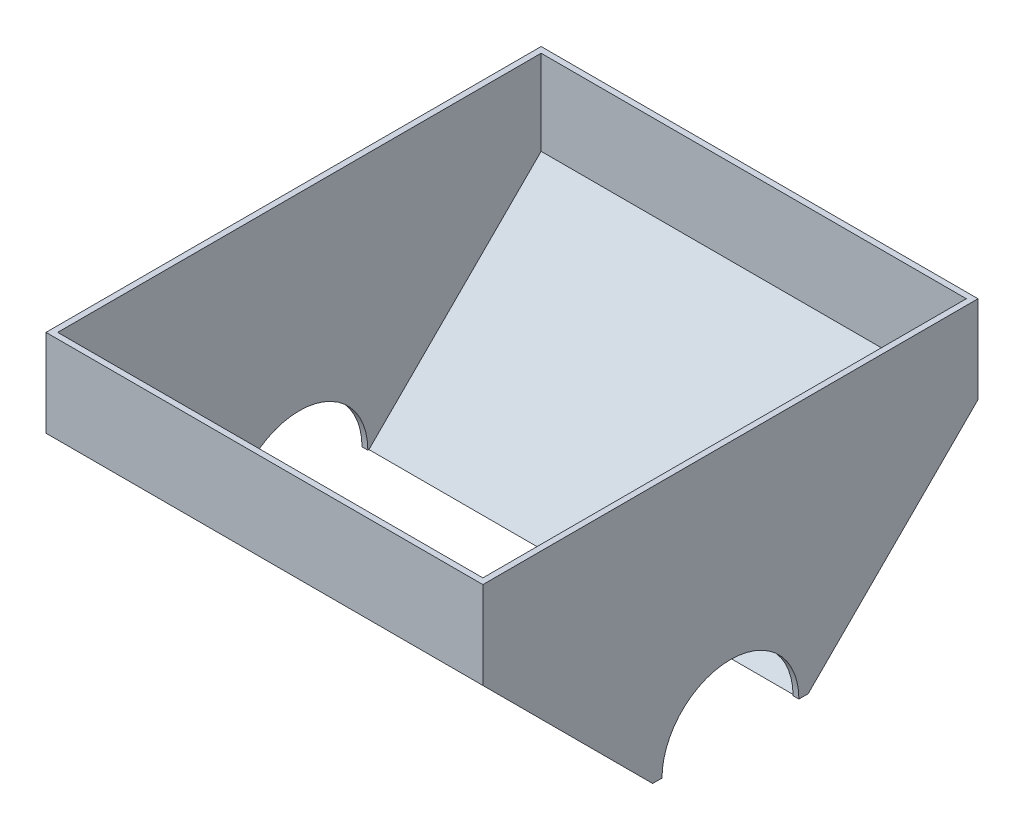
ISO-10303-21;
HEADER;
FILE_DESCRIPTION(('STEP AP214'),'2;1');
FILE_NAME('part.step','',(''),(''),'','','');
FILE_SCHEMA(('AUTOMOTIVE_DESIGN { 1 0 10303 214 1 1 1 1 }'));
ENDSEC;
DATA;
#1=APPLICATION_CONTEXT('core data for automotive mechanical design processes');
#2=APPLICATION_PROTOCOL_DEFINITION('international standard','automotive_design',2000,#1);
#3=PRODUCT_CONTEXT('',#1,'mechanical');
#4=PRODUCT('Part','Part','',(#3));
#5=PRODUCT_RELATED_PRODUCT_CATEGORY('part','',(#4));
#6=PRODUCT_DEFINITION_FORMATION('','',#4);
#7=PRODUCT_DEFINITION_CONTEXT('part definition',#1,'design');
#8=PRODUCT_DEFINITION('design','',#6,#7);
#9=PRODUCT_DEFINITION_SHAPE('','',#8);
#10=(LENGTH_UNIT() NAMED_UNIT(*) SI_UNIT(.MILLI.,.METRE.));
#11=(NAMED_UNIT(*) PLANE_ANGLE_UNIT() SI_UNIT($,.RADIAN.));
#12=(NAMED_UNIT(*) SI_UNIT($,.STERADIAN.) SOLID_ANGLE_UNIT());
#13=UNCERTAINTY_MEASURE_WITH_UNIT(LENGTH_MEASURE(1.E-05),#10,'distance_accuracy_value','');
#14=(GEOMETRIC_REPRESENTATION_CONTEXT(3) GLOBAL_UNCERTAINTY_ASSIGNED_CONTEXT((#13)) GLOBAL_UNIT_ASSIGNED_CONTEXT((#10,
#11,#12)) REPRESENTATION_CONTEXT('',''));
#15=CARTESIAN_POINT('',(0.,0.,0.));
#16=DIRECTION('',(0.,0.,1.));
#17=DIRECTION('',(1.,0.,0.));
#18=AXIS2_PLACEMENT_3D('',#15,#16,#17);
#19=CARTESIAN_POINT('',(75.,-88.2952718109188,26.704728189081));
#20=DIRECTION('',(0.,1.,0.));
#21=DIRECTION('',(0.,0.,1.));
#22=AXIS2_PLACEMENT_3D('',#19,#20,#21);
#23=PLANE('',#22);
#24=DIRECTION('',(0.,0.,-1.));
#25=VECTOR('',#24,1.);
#26=CARTESIAN_POINT('',(-75.,-88.2952718109188,26.704728189081));
#27=LINE('',#26,#25);
#28=CARTESIAN_POINT('',(-75.,-88.2952718109188,26.704728189081));
#29=VERTEX_POINT('',#28);
#30=CARTESIAN_POINT('',(-75.,-88.2952718109188,23.5));
#31=VERTEX_POINT('',#30);
#32=EDGE_CURVE('E180',#29,#31,#27,.T.);
#33=ORIENTED_EDGE('',*,*,#32,.T.);
#34=DIRECTION('',(1.,0.,0.));
#35=VECTOR('',#34,1.);
#36=CARTESIAN_POINT('',(-75.,-88.2952718109188,23.5));
#37=LINE('',#36,#35);
#38=CARTESIAN_POINT('',(-73.,-88.2952718109188,23.5));
#39=VERTEX_POINT('',#38);
#40=EDGE_CURVE('E155',#31,#39,#37,.T.);
#41=ORIENTED_EDGE('',*,*,#40,.T.);
#42=DIRECTION('',(0.,0.,-1.));
#43=VECTOR('',#42,1.);
#44=CARTESIAN_POINT('',(-73.,-88.2952718109188,26.704728189081));
#45=LINE('',#44,#43);
#46=CARTESIAN_POINT('',(-73.,-88.2952718109188,23.8763010643348));
#47=VERTEX_POINT('',#46);
#48=EDGE_CURVE('E267',#47,#39,#45,.T.);
#49=ORIENTED_EDGE('',*,*,#48,.F.);
#50=DIRECTION('',(-1.,0.,0.));
#51=VECTOR('',#50,1.);
#52=CARTESIAN_POINT('',(75.,-88.2952718109188,23.8763010643348));
#53=LINE('',#52,#51);
#54=CARTESIAN_POINT('',(73.,-88.2952718109188,23.8763010643348));
#55=VERTEX_POINT('',#54);
#56=EDGE_CURVE('E265',#55,#47,#53,.T.);
#57=ORIENTED_EDGE('',*,*,#56,.F.);
#58=DIRECTION('',(0.,0.,-1.));
#59=VECTOR('',#58,1.);
#60=CARTESIAN_POINT('',(73.,-88.2952718109188,26.704728189081));
#61=LINE('',#60,#59);
#62=CARTESIAN_POINT('',(73.,-88.2952718109188,23.5));
#63=VERTEX_POINT('',#62);
#64=EDGE_CURVE('E256',#55,#63,#61,.T.);
#65=ORIENTED_EDGE('',*,*,#64,.T.);
#66=CARTESIAN_POINT('',(75.,-88.2952718109188,23.5));
#67=VERTEX_POINT('',#66);
#68=EDGE_CURVE('E57',#63,#67,#37,.T.);
#69=ORIENTED_EDGE('',*,*,#68,.T.);
#70=DIRECTION('',(0.,0.,-1.));
#71=VECTOR('',#70,1.);
#72=CARTESIAN_POINT('',(75.,-88.2952718109188,26.704728189081));
#73=LINE('',#72,#71);
#74=CARTESIAN_POINT('',(75.,-88.2952718109188,26.704728189081));
#75=VERTEX_POINT('',#74);
#76=EDGE_CURVE('E244',#75,#67,#73,.T.);
#77=ORIENTED_EDGE('',*,*,#76,.F.);
#78=DIRECTION('',(-1.,0.,0.));
#79=VECTOR('',#78,1.);
#80=CARTESIAN_POINT('',(75.,-88.2952718109188,26.704728189081));
#81=LINE('',#80,#79);
#82=EDGE_CURVE('E210',#75,#29,#81,.T.);
#83=ORIENTED_EDGE('',*,*,#82,.T.);
#84=EDGE_LOOP('',(#33,#41,#49,#57,#65,#69,#77,#83));
#85=FACE_BOUND('',#84,.T.);
#86=ADVANCED_FACE('F41',(#85),#23,.F.);
#87=CARTESIAN_POINT('',(75.,-88.2952718109188,-23.5));
#88=VERTEX_POINT('',#87);
#89=CARTESIAN_POINT('',(75.,-88.2952718109188,-26.704728189081));
#90=VERTEX_POINT('',#89);
#91=EDGE_CURVE('E248',#88,#90,#73,.T.);
#92=ORIENTED_EDGE('',*,*,#91,.F.);
#93=DIRECTION('',(1.,0.,0.));
#94=VECTOR('',#93,1.);
#95=CARTESIAN_POINT('',(-75.,-88.2952718109188,-23.5));
#96=LINE('',#95,#94);
#97=CARTESIAN_POINT('',(73.,-88.2952718109188,-23.5));
#98=VERTEX_POINT('',#97);
#99=EDGE_CURVE('E174',#88,#98,#96,.F.);
#100=ORIENTED_EDGE('',*,*,#99,.T.);
#101=CARTESIAN_POINT('',(73.,-88.2952718109188,-23.8763010643348));
#102=VERTEX_POINT('',#101);
#103=EDGE_CURVE('E261',#98,#102,#61,.T.);
#104=ORIENTED_EDGE('',*,*,#103,.T.);
#105=DIRECTION('',(-1.,0.,0.));
#106=VECTOR('',#105,1.);
#107=CARTESIAN_POINT('',(75.,-88.2952718109188,-23.8763010643348));
#108=LINE('',#107,#106);
#109=CARTESIAN_POINT('',(-73.,-88.2952718109188,-23.8763010643348));
#110=VERTEX_POINT('',#109);
#111=EDGE_CURVE('E262',#102,#110,#108,.T.);
#112=ORIENTED_EDGE('',*,*,#111,.T.);
#113=CARTESIAN_POINT('',(-73.,-88.2952718109188,-23.5));
#114=VERTEX_POINT('',#113);
#115=EDGE_CURVE('E171',#114,#110,#45,.T.);
#116=ORIENTED_EDGE('',*,*,#115,.F.);
#117=CARTESIAN_POINT('',(-75.,-88.2952718109188,-23.5));
#118=VERTEX_POINT('',#117);
#119=EDGE_CURVE('E64',#114,#118,#96,.F.);
#120=ORIENTED_EDGE('',*,*,#119,.T.);
#121=CARTESIAN_POINT('',(-75.,-88.2952718109188,-26.704728189081));
#122=VERTEX_POINT('',#121);
#123=EDGE_CURVE('E168',#118,#122,#27,.T.);
#124=ORIENTED_EDGE('',*,*,#123,.T.);
#125=DIRECTION('',(-1.,0.,0.));
#126=VECTOR('',#125,1.);
#127=CARTESIAN_POINT('',(75.,-88.2952718109188,-26.704728189081));
#128=LINE('',#127,#126);
#129=EDGE_CURVE('E207',#90,#122,#128,.T.);
#130=ORIENTED_EDGE('',*,*,#129,.F.);
#131=EDGE_LOOP('',(#92,#100,#104,#112,#116,#120,#124,#130));
#132=FACE_BOUND('',#131,.T.);
#133=ADVANCED_FACE('F166',(#132),#23,.F.);
#134=CARTESIAN_POINT('',(75.,0.,0.));
#135=DIRECTION('',(0.,-1.,0.));
#136=DIRECTION('',(0.,0.,-1.));
#137=AXIS2_PLACEMENT_3D('',#134,#135,#136);
#138=PLANE('',#137);
#139=DIRECTION('',(0.,0.,1.));
#140=VECTOR('',#139,1.);
#141=CARTESIAN_POINT('',(-75.,0.,0.));
#142=LINE('',#141,#140);
#143=CARTESIAN_POINT('',(-75.,0.,-85.));
#144=VERTEX_POINT('',#143);
#145=CARTESIAN_POINT('',(-75.,0.,85.));
#146=VERTEX_POINT('',#145);
#147=EDGE_CURVE('E194',#144,#146,#142,.T.);
#148=ORIENTED_EDGE('',*,*,#147,.T.);
#149=DIRECTION('',(-1.,0.,0.));
#150=VECTOR('',#149,1.);
#151=CARTESIAN_POINT('',(75.,0.,85.));
#152=LINE('',#151,#150);
#153=CARTESIAN_POINT('',(75.,0.,85.));
#154=VERTEX_POINT('',#153);
#155=EDGE_CURVE('E50',#154,#146,#152,.T.);
#156=ORIENTED_EDGE('',*,*,#155,.F.);
#157=DIRECTION('',(0.,0.,1.));
#158=VECTOR('',#157,1.);
#159=CARTESIAN_POINT('',(75.,0.,0.));
#160=LINE('',#159,#158);
#161=CARTESIAN_POINT('',(75.,0.,-85.));
#162=VERTEX_POINT('',#161);
#163=EDGE_CURVE('E197',#162,#154,#160,.T.);
#164=ORIENTED_EDGE('',*,*,#163,.F.);
#165=DIRECTION('',(-1.,0.,0.));
#166=VECTOR('',#165,1.);
#167=CARTESIAN_POINT('',(75.,0.,-85.));
#168=LINE('',#167,#166);
#169=EDGE_CURVE('E198',#162,#144,#168,.T.);
#170=ORIENTED_EDGE('',*,*,#169,.T.);
#171=EDGE_LOOP('',(#148,#156,#164,#170));
#172=FACE_BOUND('',#171,.T.);
#173=DIRECTION('',(0.,0.,1.));
#174=VECTOR('',#173,1.);
#175=CARTESIAN_POINT('',(-73.,0.,0.));
#176=LINE('',#175,#174);
#177=CARTESIAN_POINT('',(-73.,0.,-83.));
#178=VERTEX_POINT('',#177);
#179=CARTESIAN_POINT('',(-73.,0.,83.));
#180=VERTEX_POINT('',#179);
#181=EDGE_CURVE('E275',#178,#180,#176,.T.);
#182=ORIENTED_EDGE('',*,*,#181,.F.);
#183=DIRECTION('',(-1.,0.,0.));
#184=VECTOR('',#183,1.);
#185=CARTESIAN_POINT('',(75.,0.,-83.));
#186=LINE('',#185,#184);
#187=CARTESIAN_POINT('',(73.,0.,-83.));
#188=VERTEX_POINT('',#187);
#189=EDGE_CURVE('E280',#188,#178,#186,.T.);
#190=ORIENTED_EDGE('',*,*,#189,.F.);
#191=DIRECTION('',(0.,0.,1.));
#192=VECTOR('',#191,1.);
#193=CARTESIAN_POINT('',(73.,0.,0.));
#194=LINE('',#193,#192);
#195=CARTESIAN_POINT('',(73.,0.,83.));
#196=VERTEX_POINT('',#195);
#197=EDGE_CURVE('E278',#188,#196,#194,.T.);
#198=ORIENTED_EDGE('',*,*,#197,.T.);
#199=DIRECTION('',(-1.,0.,0.));
#200=VECTOR('',#199,1.);
#201=CARTESIAN_POINT('',(75.,0.,83.));
#202=LINE('',#201,#200);
#203=EDGE_CURVE('E233',#196,#180,#202,.T.);
#204=ORIENTED_EDGE('',*,*,#203,.T.);
#205=EDGE_LOOP('',(#182,#190,#198,#204));
#206=FACE_BOUND('',#205,.T.);
#207=ADVANCED_FACE('F226',(#172,#206),#138,.F.);
#208=CARTESIAN_POINT('',(75.,0.,85.));
#209=DIRECTION('',(0.,0.,-1.));
#210=DIRECTION('',(0.,1.,0.));
#211=AXIS2_PLACEMENT_3D('',#208,#209,#210);
#212=PLANE('',#211);
#213=DIRECTION('',(0.,-1.,0.));
#214=VECTOR('',#213,1.);
#215=CARTESIAN_POINT('',(-75.,0.,85.));
#216=LINE('',#215,#214);
#217=CARTESIAN_POINT('',(-75.,-30.,85.));
#218=VERTEX_POINT('',#217);
#219=EDGE_CURVE('E185',#146,#218,#216,.T.);
#220=ORIENTED_EDGE('',*,*,#219,.T.);
#221=DIRECTION('',(-1.,0.,0.));
#222=VECTOR('',#221,1.);
#223=CARTESIAN_POINT('',(75.,-30.,85.));
#224=LINE('',#223,#222);
#225=CARTESIAN_POINT('',(75.,-30.,85.));
#226=VERTEX_POINT('',#225);
#227=EDGE_CURVE('E214',#226,#218,#224,.T.);
#228=ORIENTED_EDGE('',*,*,#227,.F.);
#229=DIRECTION('',(0.,-1.,0.));
#230=VECTOR('',#229,1.);
#231=CARTESIAN_POINT('',(75.,0.,85.));
#232=LINE('',#231,#230);
#233=EDGE_CURVE('E223',#154,#226,#232,.T.);
#234=ORIENTED_EDGE('',*,*,#233,.F.);
#235=ORIENTED_EDGE('',*,*,#155,.T.);
#236=EDGE_LOOP('',(#220,#228,#234,#235));
#237=FACE_BOUND('',#236,.T.);
#238=ADVANCED_FACE('F43',(#237),#212,.F.);
#239=CARTESIAN_POINT('',(75.,-30.,85.));
#240=DIRECTION('',(0.,0.707106781186549,-0.707106781186546));
#241=DIRECTION('',(0.,0.707106781186546,0.707106781186549));
#242=AXIS2_PLACEMENT_3D('',#239,#240,#241);
#243=PLANE('',#242);
#244=DIRECTION('',(0.,-0.707106781186546,-0.707106781186549));
#245=VECTOR('',#244,1.);
#246=CARTESIAN_POINT('',(-75.,-30.,85.));
#247=LINE('',#246,#245);
#248=EDGE_CURVE('E181',#218,#29,#247,.T.);
#249=ORIENTED_EDGE('',*,*,#248,.T.);
#250=ORIENTED_EDGE('',*,*,#82,.F.);
#251=DIRECTION('',(0.,-0.707106781186546,-0.707106781186549));
#252=VECTOR('',#251,1.);
#253=CARTESIAN_POINT('',(75.,-30.,85.));
#254=LINE('',#253,#252);
#255=EDGE_CURVE('E249',#226,#75,#254,.T.);
#256=ORIENTED_EDGE('',*,*,#255,.F.);
#257=ORIENTED_EDGE('',*,*,#227,.T.);
#258=EDGE_LOOP('',(#249,#250,#256,#257));
#259=FACE_BOUND('',#258,.T.);
#260=ADVANCED_FACE('F333',(#259),#243,.F.);
#261=CARTESIAN_POINT('',(75.,-30.,-85.));
#262=DIRECTION('',(0.,0.707106781186549,0.707106781186546));
#263=DIRECTION('',(0.,-0.707106781186546,0.707106781186549));
#264=AXIS2_PLACEMENT_3D('',#261,#262,#263);
#265=PLANE('',#264);
#266=DIRECTION('',(0.,0.707106781186546,-0.707106781186549));
#267=VECTOR('',#266,1.);
#268=CARTESIAN_POINT('',(-75.,-30.,-85.));
#269=LINE('',#268,#267);
#270=CARTESIAN_POINT('',(-75.,-30.,-85.));
#271=VERTEX_POINT('',#270);
#272=EDGE_CURVE('E178',#122,#271,#269,.T.);
#273=ORIENTED_EDGE('',*,*,#272,.T.);
#274=DIRECTION('',(-1.,0.,0.));
#275=VECTOR('',#274,1.);
#276=CARTESIAN_POINT('',(75.,-30.,-85.));
#277=LINE('',#276,#275);
#278=CARTESIAN_POINT('',(75.,-30.,-85.));
#279=VERTEX_POINT('',#278);
#280=EDGE_CURVE('E202',#279,#271,#277,.T.);
#281=ORIENTED_EDGE('',*,*,#280,.F.);
#282=DIRECTION('',(0.,0.707106781186546,-0.707106781186549));
#283=VECTOR('',#282,1.);
#284=CARTESIAN_POINT('',(75.,-30.,-85.));
#285=LINE('',#284,#283);
#286=EDGE_CURVE('E241',#90,#279,#285,.T.);
#287=ORIENTED_EDGE('',*,*,#286,.F.);
#288=ORIENTED_EDGE('',*,*,#129,.T.);
#289=EDGE_LOOP('',(#273,#281,#287,#288));
#290=FACE_BOUND('',#289,.T.);
#291=ADVANCED_FACE('F378',(#290),#265,.F.);
#292=CARTESIAN_POINT('',(75.,0.,-85.));
#293=DIRECTION('',(0.,0.,1.));
#294=DIRECTION('',(0.,-1.,0.));
#295=AXIS2_PLACEMENT_3D('',#292,#293,#294);
#296=PLANE('',#295);
#297=DIRECTION('',(0.,1.,0.));
#298=VECTOR('',#297,1.);
#299=CARTESIAN_POINT('',(-75.,0.,-85.));
#300=LINE('',#299,#298);
#301=EDGE_CURVE('E191',#271,#144,#300,.T.);
#302=ORIENTED_EDGE('',*,*,#301,.T.);
#303=ORIENTED_EDGE('',*,*,#169,.F.);
#304=DIRECTION('',(0.,1.,0.));
#305=VECTOR('',#304,1.);
#306=CARTESIAN_POINT('',(75.,0.,-85.));
#307=LINE('',#306,#305);
#308=EDGE_CURVE('E203',#279,#162,#307,.T.);
#309=ORIENTED_EDGE('',*,*,#308,.F.);
#310=ORIENTED_EDGE('',*,*,#280,.T.);
#311=EDGE_LOOP('',(#302,#303,#309,#310));
#312=FACE_BOUND('',#311,.T.);
#313=ADVANCED_FACE('F383',(#312),#296,.F.);
#314=CARTESIAN_POINT('',(75.,0.,0.));
#315=DIRECTION('',(1.,0.,0.));
#316=DIRECTION('',(0.,0.,-1.));
#317=AXIS2_PLACEMENT_3D('',#314,#315,#316);
#318=PLANE('',#317);
#319=CARTESIAN_POINT('',(75.,-88.2952718109188,0.));
#320=DIRECTION('',(1.,0.,0.));
#321=DIRECTION('',(0.,0.,-1.));
#322=AXIS2_PLACEMENT_3D('',#319,#320,#321);
#323=CIRCLE('',#322,23.5);
#324=EDGE_CURVE('E161',#88,#67,#323,.T.);
#325=ORIENTED_EDGE('',*,*,#324,.F.);
#326=ORIENTED_EDGE('',*,*,#91,.T.);
#327=ORIENTED_EDGE('',*,*,#286,.T.);
#328=ORIENTED_EDGE('',*,*,#308,.T.);
#329=ORIENTED_EDGE('',*,*,#163,.T.);
#330=ORIENTED_EDGE('',*,*,#233,.T.);
#331=ORIENTED_EDGE('',*,*,#255,.T.);
#332=ORIENTED_EDGE('',*,*,#76,.T.);
#333=EDGE_LOOP('',(#325,#326,#327,#328,#329,#330,#331,#332));
#334=FACE_BOUND('',#333,.T.);
#335=ADVANCED_FACE('F329',(#334),#318,.T.);
#336=CARTESIAN_POINT('',(-75.,0.,0.));
#337=DIRECTION('',(1.,0.,0.));
#338=DIRECTION('',(0.,0.,-1.));
#339=AXIS2_PLACEMENT_3D('',#336,#337,#338);
#340=PLANE('',#339);
#341=ORIENTED_EDGE('',*,*,#123,.F.);
#342=CARTESIAN_POINT('',(-75.,-88.2952718109188,0.));
#343=DIRECTION('',(1.,0.,0.));
#344=DIRECTION('',(0.,0.,-1.));
#345=AXIS2_PLACEMENT_3D('',#342,#343,#344);
#346=CIRCLE('',#345,23.5);
#347=EDGE_CURVE('E152',#118,#31,#346,.T.);
#348=ORIENTED_EDGE('',*,*,#347,.T.);
#349=ORIENTED_EDGE('',*,*,#32,.F.);
#350=ORIENTED_EDGE('',*,*,#248,.F.);
#351=ORIENTED_EDGE('',*,*,#219,.F.);
#352=ORIENTED_EDGE('',*,*,#147,.F.);
#353=ORIENTED_EDGE('',*,*,#301,.F.);
#354=ORIENTED_EDGE('',*,*,#272,.F.);
#355=EDGE_LOOP('',(#341,#348,#349,#350,#351,#352,#353,#354));
#356=FACE_BOUND('',#355,.T.);
#357=ADVANCED_FACE('F176',(#356),#340,.F.);
#358=CARTESIAN_POINT('',(75.,0.,83.));
#359=DIRECTION('',(0.,0.,-1.));
#360=DIRECTION('',(0.,1.,0.));
#361=AXIS2_PLACEMENT_3D('',#358,#359,#360);
#362=PLANE('',#361);
#363=DIRECTION('',(0.,-1.,0.));
#364=VECTOR('',#363,1.);
#365=CARTESIAN_POINT('',(-73.,0.,83.));
#366=LINE('',#365,#364);
#367=CARTESIAN_POINT('',(-73.,-29.1715728752538,83.));
#368=VERTEX_POINT('',#367);
#369=EDGE_CURVE('E307',#180,#368,#366,.T.);
#370=ORIENTED_EDGE('',*,*,#369,.F.);
#371=ORIENTED_EDGE('',*,*,#203,.F.);
#372=DIRECTION('',(0.,-1.,0.));
#373=VECTOR('',#372,1.);
#374=CARTESIAN_POINT('',(73.,0.,83.));
#375=LINE('',#374,#373);
#376=CARTESIAN_POINT('',(73.,-29.1715728752538,83.));
#377=VERTEX_POINT('',#376);
#378=EDGE_CURVE('E287',#196,#377,#375,.T.);
#379=ORIENTED_EDGE('',*,*,#378,.T.);
#380=DIRECTION('',(-1.,0.,0.));
#381=VECTOR('',#380,1.);
#382=CARTESIAN_POINT('',(75.,-29.1715728752538,83.));
#383=LINE('',#382,#381);
#384=EDGE_CURVE('E236',#377,#368,#383,.T.);
#385=ORIENTED_EDGE('',*,*,#384,.T.);
#386=EDGE_LOOP('',(#370,#371,#379,#385));
#387=FACE_BOUND('',#386,.T.);
#388=ADVANCED_FACE('F364',(#387),#362,.T.);
#389=CARTESIAN_POINT('',(75.,-28.5857864376269,83.5857864376269));
#390=DIRECTION('',(0.,0.707106781186549,-0.707106781186546));
#391=DIRECTION('',(0.,0.707106781186546,0.707106781186549));
#392=AXIS2_PLACEMENT_3D('',#389,#390,#391);
#393=PLANE('',#392);
#394=DIRECTION('',(0.,-0.707106781186546,-0.707106781186549));
#395=VECTOR('',#394,1.);
#396=CARTESIAN_POINT('',(-73.,-28.5857864376269,83.5857864376269));
#397=LINE('',#396,#395);
#398=EDGE_CURVE('E304',#368,#47,#397,.T.);
#399=ORIENTED_EDGE('',*,*,#398,.F.);
#400=ORIENTED_EDGE('',*,*,#384,.F.);
#401=DIRECTION('',(0.,-0.707106781186546,-0.707106781186549));
#402=VECTOR('',#401,1.);
#403=CARTESIAN_POINT('',(73.,-28.5857864376269,83.5857864376269));
#404=LINE('',#403,#402);
#405=EDGE_CURVE('E300',#377,#55,#404,.T.);
#406=ORIENTED_EDGE('',*,*,#405,.T.);
#407=ORIENTED_EDGE('',*,*,#56,.T.);
#408=EDGE_LOOP('',(#399,#400,#406,#407));
#409=FACE_BOUND('',#408,.T.);
#410=ADVANCED_FACE('F341',(#409),#393,.T.);
#411=CARTESIAN_POINT('',(75.,-28.5857864376269,-83.5857864376269));
#412=DIRECTION('',(0.,0.707106781186549,0.707106781186546));
#413=DIRECTION('',(0.,-0.707106781186546,0.707106781186549));
#414=AXIS2_PLACEMENT_3D('',#411,#412,#413);
#415=PLANE('',#414);
#416=DIRECTION('',(0.,0.707106781186546,-0.707106781186549));
#417=VECTOR('',#416,1.);
#418=CARTESIAN_POINT('',(-73.,-28.5857864376269,-83.5857864376269));
#419=LINE('',#418,#417);
#420=CARTESIAN_POINT('',(-73.,-29.1715728752538,-83.));
#421=VERTEX_POINT('',#420);
#422=EDGE_CURVE('E271',#110,#421,#419,.T.);
#423=ORIENTED_EDGE('',*,*,#422,.F.);
#424=ORIENTED_EDGE('',*,*,#111,.F.);
#425=DIRECTION('',(0.,0.707106781186546,-0.707106781186549));
#426=VECTOR('',#425,1.);
#427=CARTESIAN_POINT('',(73.,-28.5857864376269,-83.5857864376269));
#428=LINE('',#427,#426);
#429=CARTESIAN_POINT('',(73.,-29.1715728752538,-83.));
#430=VERTEX_POINT('',#429);
#431=EDGE_CURVE('E260',#102,#430,#428,.T.);
#432=ORIENTED_EDGE('',*,*,#431,.T.);
#433=DIRECTION('',(-1.,0.,0.));
#434=VECTOR('',#433,1.);
#435=CARTESIAN_POINT('',(75.,-29.1715728752538,-83.));
#436=LINE('',#435,#434);
#437=EDGE_CURVE('E266',#430,#421,#436,.T.);
#438=ORIENTED_EDGE('',*,*,#437,.T.);
#439=EDGE_LOOP('',(#423,#424,#432,#438));
#440=FACE_BOUND('',#439,.T.);
#441=ADVANCED_FACE('F355',(#440),#415,.T.);
#442=CARTESIAN_POINT('',(75.,0.,-83.));
#443=DIRECTION('',(0.,0.,1.));
#444=DIRECTION('',(0.,-1.,0.));
#445=AXIS2_PLACEMENT_3D('',#442,#443,#444);
#446=PLANE('',#445);
#447=DIRECTION('',(0.,1.,0.));
#448=VECTOR('',#447,1.);
#449=CARTESIAN_POINT('',(-73.,0.,-83.));
#450=LINE('',#449,#448);
#451=EDGE_CURVE('E279',#421,#178,#450,.T.);
#452=ORIENTED_EDGE('',*,*,#451,.F.);
#453=ORIENTED_EDGE('',*,*,#437,.F.);
#454=DIRECTION('',(0.,1.,0.));
#455=VECTOR('',#454,1.);
#456=CARTESIAN_POINT('',(73.,0.,-83.));
#457=LINE('',#456,#455);
#458=EDGE_CURVE('E284',#430,#188,#457,.T.);
#459=ORIENTED_EDGE('',*,*,#458,.T.);
#460=ORIENTED_EDGE('',*,*,#189,.T.);
#461=EDGE_LOOP('',(#452,#453,#459,#460));
#462=FACE_BOUND('',#461,.T.);
#463=ADVANCED_FACE('F360',(#462),#446,.T.);
#464=CARTESIAN_POINT('',(73.,0.,0.));
#465=DIRECTION('',(1.,0.,0.));
#466=DIRECTION('',(0.,0.,-1.));
#467=AXIS2_PLACEMENT_3D('',#464,#465,#466);
#468=PLANE('',#467);
#469=ORIENTED_EDGE('',*,*,#103,.F.);
#470=CARTESIAN_POINT('',(73.,-88.2952718109188,0.));
#471=DIRECTION('',(1.,0.,0.));
#472=DIRECTION('',(0.,0.,-1.));
#473=AXIS2_PLACEMENT_3D('',#470,#471,#472);
#474=CIRCLE('',#473,23.5);
#475=EDGE_CURVE('E315',#98,#63,#474,.T.);
#476=ORIENTED_EDGE('',*,*,#475,.T.);
#477=ORIENTED_EDGE('',*,*,#64,.F.);
#478=ORIENTED_EDGE('',*,*,#405,.F.);
#479=ORIENTED_EDGE('',*,*,#378,.F.);
#480=ORIENTED_EDGE('',*,*,#197,.F.);
#481=ORIENTED_EDGE('',*,*,#458,.F.);
#482=ORIENTED_EDGE('',*,*,#431,.F.);
#483=EDGE_LOOP('',(#469,#476,#477,#478,#479,#480,#481,#482));
#484=FACE_BOUND('',#483,.T.);
#485=ADVANCED_FACE('F345',(#484),#468,.F.);
#486=CARTESIAN_POINT('',(-73.,0.,0.));
#487=DIRECTION('',(1.,0.,0.));
#488=DIRECTION('',(0.,0.,-1.));
#489=AXIS2_PLACEMENT_3D('',#486,#487,#488);
#490=PLANE('',#489);
#491=CARTESIAN_POINT('',(-73.,-88.2952718109188,0.));
#492=DIRECTION('',(1.,0.,0.));
#493=DIRECTION('',(0.,0.,-1.));
#494=AXIS2_PLACEMENT_3D('',#491,#492,#493);
#495=CIRCLE('',#494,23.5);
#496=EDGE_CURVE('E11',#114,#39,#495,.T.);
#497=ORIENTED_EDGE('',*,*,#496,.F.);
#498=ORIENTED_EDGE('',*,*,#115,.T.);
#499=ORIENTED_EDGE('',*,*,#422,.T.);
#500=ORIENTED_EDGE('',*,*,#451,.T.);
#501=ORIENTED_EDGE('',*,*,#181,.T.);
#502=ORIENTED_EDGE('',*,*,#369,.T.);
#503=ORIENTED_EDGE('',*,*,#398,.T.);
#504=ORIENTED_EDGE('',*,*,#48,.T.);
#505=EDGE_LOOP('',(#497,#498,#499,#500,#501,#502,#503,#504));
#506=FACE_BOUND('',#505,.T.);
#507=ADVANCED_FACE('F336',(#506),#490,.T.);
#508=CARTESIAN_POINT('',(-75.,-88.2952718109188,0.));
#509=DIRECTION('',(1.,0.,0.));
#510=DIRECTION('',(0.,0.,-1.));
#511=AXIS2_PLACEMENT_3D('',#508,#509,#510);
#512=CYLINDRICAL_SURFACE('',#511,23.5);
#513=ORIENTED_EDGE('',*,*,#347,.F.);
#514=ORIENTED_EDGE('',*,*,#119,.F.);
#515=ORIENTED_EDGE('',*,*,#496,.T.);
#516=ORIENTED_EDGE('',*,*,#40,.F.);
#517=EDGE_LOOP('',(#513,#514,#515,#516));
#518=FACE_BOUND('',#517,.T.);
#519=ADVANCED_FACE('F153',(#518),#512,.F.);
#520=ORIENTED_EDGE('',*,*,#475,.F.);
#521=ORIENTED_EDGE('',*,*,#99,.F.);
#522=ORIENTED_EDGE('',*,*,#324,.T.);
#523=ORIENTED_EDGE('',*,*,#68,.F.);
#524=EDGE_LOOP('',(#520,#521,#522,#523));
#525=FACE_BOUND('',#524,.T.);
#526=ADVANCED_FACE('F322',(#525),#512,.F.);
#527=CLOSED_SHELL('',(#86,#133,#207,#238,#260,#291,#313,#335,#357,#388,#410,#441,#463,#485,#507,
#519,#526));
#528=MANIFOLD_SOLID_BREP('B2',#527);
#529=ADVANCED_BREP_SHAPE_REPRESENTATION('',(#18,#528),#14);
#530=SHAPE_DEFINITION_REPRESENTATION(#9,#529);
ENDSEC;
END-ISO-10303-21;
